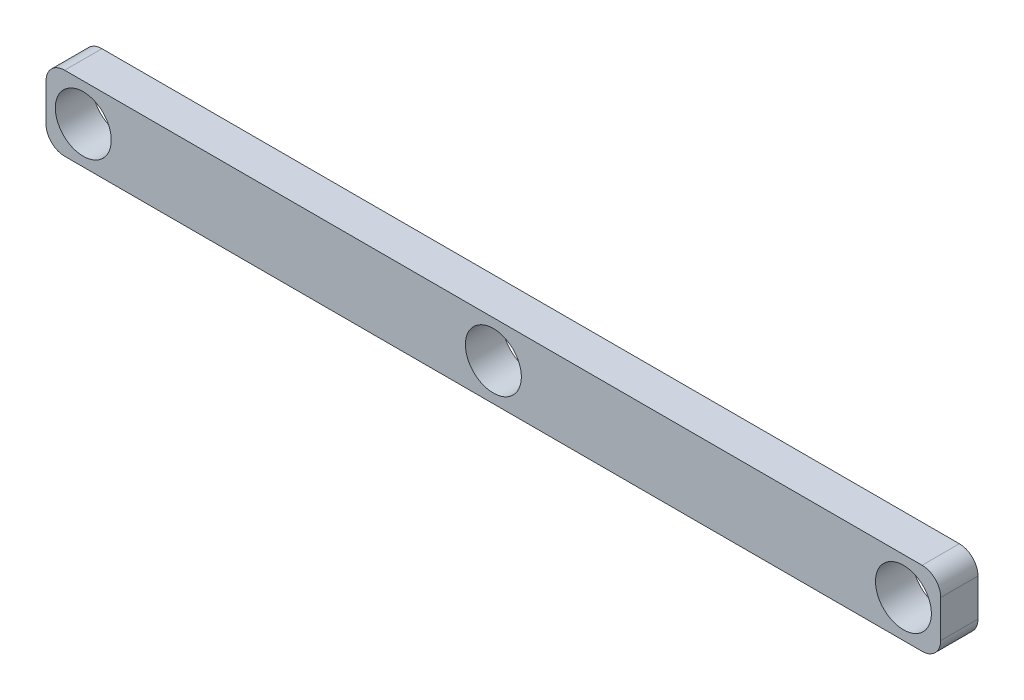
ISO-10303-21;
HEADER;
FILE_DESCRIPTION(('STEP AP214'),'2;1');
FILE_NAME('part.step','',(''),(''),'','','');
FILE_SCHEMA(('AUTOMOTIVE_DESIGN { 1 0 10303 214 1 1 1 1 }'));
ENDSEC;
DATA;
#1=APPLICATION_CONTEXT('core data for automotive mechanical design processes');
#2=APPLICATION_PROTOCOL_DEFINITION('international standard','automotive_design',2000,#1);
#3=PRODUCT_CONTEXT('',#1,'mechanical');
#4=PRODUCT('Part','Part','',(#3));
#5=PRODUCT_RELATED_PRODUCT_CATEGORY('part','',(#4));
#6=PRODUCT_DEFINITION_FORMATION('','',#4);
#7=PRODUCT_DEFINITION_CONTEXT('part definition',#1,'design');
#8=PRODUCT_DEFINITION('design','',#6,#7);
#9=PRODUCT_DEFINITION_SHAPE('','',#8);
#10=(LENGTH_UNIT() NAMED_UNIT(*) SI_UNIT(.MILLI.,.METRE.));
#11=(NAMED_UNIT(*) PLANE_ANGLE_UNIT() SI_UNIT($,.RADIAN.));
#12=(NAMED_UNIT(*) SI_UNIT($,.STERADIAN.) SOLID_ANGLE_UNIT());
#13=UNCERTAINTY_MEASURE_WITH_UNIT(LENGTH_MEASURE(1.E-05),#10,'distance_accuracy_value','');
#14=(GEOMETRIC_REPRESENTATION_CONTEXT(3) GLOBAL_UNCERTAINTY_ASSIGNED_CONTEXT((#13)) GLOBAL_UNIT_ASSIGNED_CONTEXT((#10,
#11,#12)) REPRESENTATION_CONTEXT('',''));
#15=CARTESIAN_POINT('',(0.,0.,0.));
#16=DIRECTION('',(0.,0.,1.));
#17=DIRECTION('',(1.,0.,0.));
#18=AXIS2_PLACEMENT_3D('',#15,#16,#17);
#19=CARTESIAN_POINT('',(0.,0.,25.4));
#20=DIRECTION('',(1.,0.,0.));
#21=DIRECTION('',(0.,0.,-1.));
#22=AXIS2_PLACEMENT_3D('',#19,#20,#21);
#23=PLANE('',#22);
#24=DIRECTION('',(0.,-1.,0.));
#25=VECTOR('',#24,1.);
#26=CARTESIAN_POINT('',(0.,0.,0.));
#27=LINE('',#26,#25);
#28=CARTESIAN_POINT('',(0.,38.1,0.));
#29=VERTEX_POINT('',#28);
#30=CARTESIAN_POINT('',(0.,12.7,0.));
#31=VERTEX_POINT('',#30);
#32=EDGE_CURVE('E182',#29,#31,#27,.T.);
#33=ORIENTED_EDGE('',*,*,#32,.T.);
#34=DIRECTION('',(0.,0.,-1.));
#35=VECTOR('',#34,1.);
#36=CARTESIAN_POINT('',(0.,12.7,25.4));
#37=LINE('',#36,#35);
#38=CARTESIAN_POINT('',(0.,12.7,25.4));
#39=VERTEX_POINT('',#38);
#40=EDGE_CURVE('E11',#31,#39,#37,.F.);
#41=ORIENTED_EDGE('',*,*,#40,.T.);
#42=DIRECTION('',(0.,-1.,0.));
#43=VECTOR('',#42,1.);
#44=CARTESIAN_POINT('',(0.,0.,25.4));
#45=LINE('',#44,#43);
#46=CARTESIAN_POINT('',(0.,38.1,25.4));
#47=VERTEX_POINT('',#46);
#48=EDGE_CURVE('E135',#47,#39,#45,.T.);
#49=ORIENTED_EDGE('',*,*,#48,.F.);
#50=DIRECTION('',(0.,0.,-1.));
#51=VECTOR('',#50,1.);
#52=CARTESIAN_POINT('',(0.,38.1,25.4));
#53=LINE('',#52,#51);
#54=EDGE_CURVE('E48',#47,#29,#53,.T.);
#55=ORIENTED_EDGE('',*,*,#54,.T.);
#56=EDGE_LOOP('',(#33,#41,#49,#55));
#57=FACE_BOUND('',#56,.T.);
#58=ADVANCED_FACE('F39',(#57),#23,.F.);
#59=CARTESIAN_POINT('',(0.,0.,25.4));
#60=DIRECTION('',(0.,1.,0.));
#61=DIRECTION('',(0.,0.,1.));
#62=AXIS2_PLACEMENT_3D('',#59,#60,#61);
#63=PLANE('',#62);
#64=DIRECTION('',(1.,0.,0.));
#65=VECTOR('',#64,1.);
#66=CARTESIAN_POINT('',(0.,0.,0.));
#67=LINE('',#66,#65);
#68=CARTESIAN_POINT('',(12.7,0.,0.));
#69=VERTEX_POINT('',#68);
#70=CARTESIAN_POINT('',(596.9,0.,0.));
#71=VERTEX_POINT('',#70);
#72=EDGE_CURVE('E142',#69,#71,#67,.T.);
#73=ORIENTED_EDGE('',*,*,#72,.T.);
#74=DIRECTION('',(0.,0.,-1.));
#75=VECTOR('',#74,1.);
#76=CARTESIAN_POINT('',(596.9,0.,25.4));
#77=LINE('',#76,#75);
#78=CARTESIAN_POINT('',(596.9,0.,25.4));
#79=VERTEX_POINT('',#78);
#80=EDGE_CURVE('E55',#71,#79,#77,.F.);
#81=ORIENTED_EDGE('',*,*,#80,.T.);
#82=DIRECTION('',(1.,0.,0.));
#83=VECTOR('',#82,1.);
#84=CARTESIAN_POINT('',(0.,0.,25.4));
#85=LINE('',#84,#83);
#86=CARTESIAN_POINT('',(12.7,0.,25.4));
#87=VERTEX_POINT('',#86);
#88=EDGE_CURVE('E140',#87,#79,#85,.T.);
#89=ORIENTED_EDGE('',*,*,#88,.F.);
#90=DIRECTION('',(0.,0.,-1.));
#91=VECTOR('',#90,1.);
#92=CARTESIAN_POINT('',(12.7,0.,25.4));
#93=LINE('',#92,#91);
#94=EDGE_CURVE('E171',#87,#69,#93,.T.);
#95=ORIENTED_EDGE('',*,*,#94,.T.);
#96=EDGE_LOOP('',(#73,#81,#89,#95));
#97=FACE_BOUND('',#96,.T.);
#98=ADVANCED_FACE('F247',(#97),#63,.F.);
#99=CARTESIAN_POINT('',(609.6,0.,25.4));
#100=DIRECTION('',(-1.,0.,0.));
#101=DIRECTION('',(0.,0.,1.));
#102=AXIS2_PLACEMENT_3D('',#99,#100,#101);
#103=PLANE('',#102);
#104=DIRECTION('',(0.,1.,0.));
#105=VECTOR('',#104,1.);
#106=CARTESIAN_POINT('',(609.6,0.,0.));
#107=LINE('',#106,#105);
#108=CARTESIAN_POINT('',(609.6,12.7,0.));
#109=VERTEX_POINT('',#108);
#110=CARTESIAN_POINT('',(609.6,38.1,0.));
#111=VERTEX_POINT('',#110);
#112=EDGE_CURVE('E136',#109,#111,#107,.T.);
#113=ORIENTED_EDGE('',*,*,#112,.T.);
#114=DIRECTION('',(0.,0.,-1.));
#115=VECTOR('',#114,1.);
#116=CARTESIAN_POINT('',(609.6,38.1,25.4));
#117=LINE('',#116,#115);
#118=CARTESIAN_POINT('',(609.6,38.1,25.4));
#119=VERTEX_POINT('',#118);
#120=EDGE_CURVE('E111',#111,#119,#117,.F.);
#121=ORIENTED_EDGE('',*,*,#120,.T.);
#122=DIRECTION('',(0.,1.,0.));
#123=VECTOR('',#122,1.);
#124=CARTESIAN_POINT('',(609.6,0.,25.4));
#125=LINE('',#124,#123);
#126=CARTESIAN_POINT('',(609.6,12.7,25.4));
#127=VERTEX_POINT('',#126);
#128=EDGE_CURVE('E198',#127,#119,#125,.T.);
#129=ORIENTED_EDGE('',*,*,#128,.F.);
#130=DIRECTION('',(0.,0.,-1.));
#131=VECTOR('',#130,1.);
#132=CARTESIAN_POINT('',(609.6,12.7,25.4));
#133=LINE('',#132,#131);
#134=EDGE_CURVE('E117',#127,#109,#133,.T.);
#135=ORIENTED_EDGE('',*,*,#134,.T.);
#136=EDGE_LOOP('',(#113,#121,#129,#135));
#137=FACE_BOUND('',#136,.T.);
#138=ADVANCED_FACE('F244',(#137),#103,.F.);
#139=CARTESIAN_POINT('',(0.,50.8,25.4));
#140=DIRECTION('',(0.,-1.,0.));
#141=DIRECTION('',(0.,0.,-1.));
#142=AXIS2_PLACEMENT_3D('',#139,#140,#141);
#143=PLANE('',#142);
#144=DIRECTION('',(-1.,0.,0.));
#145=VECTOR('',#144,1.);
#146=CARTESIAN_POINT('',(0.,50.8,25.4));
#147=LINE('',#146,#145);
#148=CARTESIAN_POINT('',(596.9,50.8,25.4));
#149=VERTEX_POINT('',#148);
#150=CARTESIAN_POINT('',(12.7,50.8,25.4));
#151=VERTEX_POINT('',#150);
#152=EDGE_CURVE('E127',#149,#151,#147,.T.);
#153=ORIENTED_EDGE('',*,*,#152,.F.);
#154=DIRECTION('',(0.,0.,-1.));
#155=VECTOR('',#154,1.);
#156=CARTESIAN_POINT('',(596.9,50.8,25.4));
#157=LINE('',#156,#155);
#158=CARTESIAN_POINT('',(596.9,50.8,0.));
#159=VERTEX_POINT('',#158);
#160=EDGE_CURVE('E110',#149,#159,#157,.T.);
#161=ORIENTED_EDGE('',*,*,#160,.T.);
#162=DIRECTION('',(-1.,0.,0.));
#163=VECTOR('',#162,1.);
#164=CARTESIAN_POINT('',(0.,50.8,0.));
#165=LINE('',#164,#163);
#166=CARTESIAN_POINT('',(12.7,50.8,0.));
#167=VERTEX_POINT('',#166);
#168=EDGE_CURVE('E124',#159,#167,#165,.T.);
#169=ORIENTED_EDGE('',*,*,#168,.T.);
#170=DIRECTION('',(0.,0.,-1.));
#171=VECTOR('',#170,1.);
#172=CARTESIAN_POINT('',(12.7,50.8,25.4));
#173=LINE('',#172,#171);
#174=EDGE_CURVE('E130',#167,#151,#173,.F.);
#175=ORIENTED_EDGE('',*,*,#174,.T.);
#176=EDGE_LOOP('',(#153,#161,#169,#175));
#177=FACE_BOUND('',#176,.T.);
#178=ADVANCED_FACE('F123',(#177),#143,.F.);
#179=CARTESIAN_POINT('',(0.,0.,25.4));
#180=DIRECTION('',(0.,0.,-1.));
#181=DIRECTION('',(-1.,0.,0.));
#182=AXIS2_PLACEMENT_3D('',#179,#180,#181);
#183=PLANE('',#182);
#184=CARTESIAN_POINT('',(25.4,25.4,25.4));
#185=DIRECTION('',(0.,0.,1.));
#186=DIRECTION('',(1.,0.,0.));
#187=AXIS2_PLACEMENT_3D('',#184,#185,#186);
#188=CIRCLE('',#187,19.05);
#189=CARTESIAN_POINT('',(44.45,25.4,25.4));
#190=VERTEX_POINT('',#189);
#191=EDGE_CURVE('E216',#190,#190,#188,.T.);
#192=ORIENTED_EDGE('',*,*,#191,.F.);
#193=EDGE_LOOP('',(#192));
#194=FACE_BOUND('',#193,.T.);
#195=CARTESIAN_POINT('',(304.8,25.4,25.4));
#196=DIRECTION('',(0.,0.,-1.));
#197=DIRECTION('',(-1.,0.,0.));
#198=AXIS2_PLACEMENT_3D('',#195,#196,#197);
#199=CIRCLE('',#198,19.05);
#200=CARTESIAN_POINT('',(285.75,25.4,25.4));
#201=VERTEX_POINT('',#200);
#202=EDGE_CURVE('E206',#201,#201,#199,.T.);
#203=ORIENTED_EDGE('',*,*,#202,.T.);
#204=EDGE_LOOP('',(#203));
#205=FACE_BOUND('',#204,.T.);
#206=CARTESIAN_POINT('',(584.2,25.4,25.4));
#207=DIRECTION('',(0.,0.,1.));
#208=DIRECTION('',(1.,0.,0.));
#209=AXIS2_PLACEMENT_3D('',#206,#207,#208);
#210=CIRCLE('',#209,19.05);
#211=CARTESIAN_POINT('',(603.25,25.4,25.4));
#212=VERTEX_POINT('',#211);
#213=EDGE_CURVE('E193',#212,#212,#210,.T.);
#214=ORIENTED_EDGE('',*,*,#213,.F.);
#215=EDGE_LOOP('',(#214));
#216=FACE_BOUND('',#215,.T.);
#217=ORIENTED_EDGE('',*,*,#128,.T.);
#218=CARTESIAN_POINT('',(596.9,38.1,25.4));
#219=DIRECTION('',(0.,0.,-1.));
#220=DIRECTION('',(-1.,0.,0.));
#221=AXIS2_PLACEMENT_3D('',#218,#219,#220);
#222=CIRCLE('',#221,12.7);
#223=EDGE_CURVE('E168',#119,#149,#222,.F.);
#224=ORIENTED_EDGE('',*,*,#223,.T.);
#225=ORIENTED_EDGE('',*,*,#152,.T.);
#226=CARTESIAN_POINT('',(12.7,38.1,25.4));
#227=DIRECTION('',(0.,0.,-1.));
#228=DIRECTION('',(-1.,0.,0.));
#229=AXIS2_PLACEMENT_3D('',#226,#227,#228);
#230=CIRCLE('',#229,12.7);
#231=EDGE_CURVE('E160',#151,#47,#230,.F.);
#232=ORIENTED_EDGE('',*,*,#231,.T.);
#233=ORIENTED_EDGE('',*,*,#48,.T.);
#234=CARTESIAN_POINT('',(12.7,12.7,25.4));
#235=DIRECTION('',(0.,0.,-1.));
#236=DIRECTION('',(-1.,0.,0.));
#237=AXIS2_PLACEMENT_3D('',#234,#235,#236);
#238=CIRCLE('',#237,12.7);
#239=EDGE_CURVE('E62',#39,#87,#238,.F.);
#240=ORIENTED_EDGE('',*,*,#239,.T.);
#241=ORIENTED_EDGE('',*,*,#88,.T.);
#242=CARTESIAN_POINT('',(596.9,12.7,25.4));
#243=DIRECTION('',(0.,0.,-1.));
#244=DIRECTION('',(-1.,0.,0.));
#245=AXIS2_PLACEMENT_3D('',#242,#243,#244);
#246=CIRCLE('',#245,12.7);
#247=EDGE_CURVE('E165',#79,#127,#246,.F.);
#248=ORIENTED_EDGE('',*,*,#247,.T.);
#249=EDGE_LOOP('',(#217,#224,#225,#232,#233,#240,#241,#248));
#250=FACE_BOUND('',#249,.T.);
#251=ADVANCED_FACE('F233',(#194,#205,#216,#250),#183,.F.);
#252=CARTESIAN_POINT('',(0.,0.,0.));
#253=DIRECTION('',(0.,0.,-1.));
#254=DIRECTION('',(-1.,0.,0.));
#255=AXIS2_PLACEMENT_3D('',#252,#253,#254);
#256=PLANE('',#255);
#257=CARTESIAN_POINT('',(25.4,25.4,0.));
#258=DIRECTION('',(0.,0.,1.));
#259=DIRECTION('',(1.,0.,0.));
#260=AXIS2_PLACEMENT_3D('',#257,#258,#259);
#261=CIRCLE('',#260,19.05);
#262=CARTESIAN_POINT('',(44.45,25.4,0.));
#263=VERTEX_POINT('',#262);
#264=EDGE_CURVE('E212',#263,#263,#261,.T.);
#265=ORIENTED_EDGE('',*,*,#264,.T.);
#266=EDGE_LOOP('',(#265));
#267=FACE_BOUND('',#266,.T.);
#268=CARTESIAN_POINT('',(304.8,25.4,0.));
#269=DIRECTION('',(0.,0.,-1.));
#270=DIRECTION('',(-1.,0.,0.));
#271=AXIS2_PLACEMENT_3D('',#268,#269,#270);
#272=CIRCLE('',#271,19.05);
#273=CARTESIAN_POINT('',(285.75,25.4,0.));
#274=VERTEX_POINT('',#273);
#275=EDGE_CURVE('E208',#274,#274,#272,.T.);
#276=ORIENTED_EDGE('',*,*,#275,.F.);
#277=EDGE_LOOP('',(#276));
#278=FACE_BOUND('',#277,.T.);
#279=CARTESIAN_POINT('',(584.2,25.4,0.));
#280=DIRECTION('',(0.,0.,1.));
#281=DIRECTION('',(1.,0.,0.));
#282=AXIS2_PLACEMENT_3D('',#279,#280,#281);
#283=CIRCLE('',#282,19.05);
#284=CARTESIAN_POINT('',(603.25,25.4,0.));
#285=VERTEX_POINT('',#284);
#286=EDGE_CURVE('E188',#285,#285,#283,.T.);
#287=ORIENTED_EDGE('',*,*,#286,.T.);
#288=EDGE_LOOP('',(#287));
#289=FACE_BOUND('',#288,.T.);
#290=ORIENTED_EDGE('',*,*,#168,.F.);
#291=CARTESIAN_POINT('',(596.9,38.1,0.));
#292=DIRECTION('',(0.,0.,-1.));
#293=DIRECTION('',(-1.,0.,0.));
#294=AXIS2_PLACEMENT_3D('',#291,#292,#293);
#295=CIRCLE('',#294,12.7);
#296=EDGE_CURVE('E106',#159,#111,#295,.T.);
#297=ORIENTED_EDGE('',*,*,#296,.T.);
#298=ORIENTED_EDGE('',*,*,#112,.F.);
#299=CARTESIAN_POINT('',(596.9,12.7,0.));
#300=DIRECTION('',(0.,0.,-1.));
#301=DIRECTION('',(-1.,0.,0.));
#302=AXIS2_PLACEMENT_3D('',#299,#300,#301);
#303=CIRCLE('',#302,12.7);
#304=EDGE_CURVE('E118',#109,#71,#303,.T.);
#305=ORIENTED_EDGE('',*,*,#304,.T.);
#306=ORIENTED_EDGE('',*,*,#72,.F.);
#307=CARTESIAN_POINT('',(12.7,12.7,0.));
#308=DIRECTION('',(0.,0.,-1.));
#309=DIRECTION('',(-1.,0.,0.));
#310=AXIS2_PLACEMENT_3D('',#307,#308,#309);
#311=CIRCLE('',#310,12.7);
#312=EDGE_CURVE('E150',#69,#31,#311,.T.);
#313=ORIENTED_EDGE('',*,*,#312,.T.);
#314=ORIENTED_EDGE('',*,*,#32,.F.);
#315=CARTESIAN_POINT('',(12.7,38.1,0.));
#316=DIRECTION('',(0.,0.,-1.));
#317=DIRECTION('',(-1.,0.,0.));
#318=AXIS2_PLACEMENT_3D('',#315,#316,#317);
#319=CIRCLE('',#318,12.7);
#320=EDGE_CURVE('E129',#29,#167,#319,.T.);
#321=ORIENTED_EDGE('',*,*,#320,.T.);
#322=EDGE_LOOP('',(#290,#297,#298,#305,#306,#313,#314,#321));
#323=FACE_BOUND('',#322,.T.);
#324=ADVANCED_FACE('F132',(#267,#278,#289,#323),#256,.T.);
#325=CARTESIAN_POINT('',(596.9,38.1,25.4));
#326=DIRECTION('',(0.,0.,-1.));
#327=DIRECTION('',(-1.,0.,0.));
#328=AXIS2_PLACEMENT_3D('',#325,#326,#327);
#329=CYLINDRICAL_SURFACE('',#328,12.7);
#330=ORIENTED_EDGE('',*,*,#223,.F.);
#331=ORIENTED_EDGE('',*,*,#120,.F.);
#332=ORIENTED_EDGE('',*,*,#296,.F.);
#333=ORIENTED_EDGE('',*,*,#160,.F.);
#334=EDGE_LOOP('',(#330,#331,#332,#333));
#335=FACE_BOUND('',#334,.T.);
#336=ADVANCED_FACE('F109',(#335),#329,.T.);
#337=CARTESIAN_POINT('',(596.9,12.7,25.4));
#338=DIRECTION('',(0.,0.,-1.));
#339=DIRECTION('',(-1.,0.,0.));
#340=AXIS2_PLACEMENT_3D('',#337,#338,#339);
#341=CYLINDRICAL_SURFACE('',#340,12.7);
#342=ORIENTED_EDGE('',*,*,#247,.F.);
#343=ORIENTED_EDGE('',*,*,#80,.F.);
#344=ORIENTED_EDGE('',*,*,#304,.F.);
#345=ORIENTED_EDGE('',*,*,#134,.F.);
#346=EDGE_LOOP('',(#342,#343,#344,#345));
#347=FACE_BOUND('',#346,.T.);
#348=ADVANCED_FACE('F246',(#347),#341,.T.);
#349=CARTESIAN_POINT('',(12.7,12.7,25.4));
#350=DIRECTION('',(0.,0.,-1.));
#351=DIRECTION('',(-1.,0.,0.));
#352=AXIS2_PLACEMENT_3D('',#349,#350,#351);
#353=CYLINDRICAL_SURFACE('',#352,12.7);
#354=ORIENTED_EDGE('',*,*,#239,.F.);
#355=ORIENTED_EDGE('',*,*,#40,.F.);
#356=ORIENTED_EDGE('',*,*,#312,.F.);
#357=ORIENTED_EDGE('',*,*,#94,.F.);
#358=EDGE_LOOP('',(#354,#355,#356,#357));
#359=FACE_BOUND('',#358,.T.);
#360=ADVANCED_FACE('F250',(#359),#353,.T.);
#361=CARTESIAN_POINT('',(12.7,38.1,25.4));
#362=DIRECTION('',(0.,0.,-1.));
#363=DIRECTION('',(-1.,0.,0.));
#364=AXIS2_PLACEMENT_3D('',#361,#362,#363);
#365=CYLINDRICAL_SURFACE('',#364,12.7);
#366=ORIENTED_EDGE('',*,*,#231,.F.);
#367=ORIENTED_EDGE('',*,*,#174,.F.);
#368=ORIENTED_EDGE('',*,*,#320,.F.);
#369=ORIENTED_EDGE('',*,*,#54,.F.);
#370=EDGE_LOOP('',(#366,#367,#368,#369));
#371=FACE_BOUND('',#370,.T.);
#372=ADVANCED_FACE('F41',(#371),#365,.T.);
#373=CARTESIAN_POINT('',(584.2,25.4,0.));
#374=DIRECTION('',(0.,0.,1.));
#375=DIRECTION('',(1.,0.,0.));
#376=AXIS2_PLACEMENT_3D('',#373,#374,#375);
#377=CYLINDRICAL_SURFACE('',#376,19.05);
#378=ORIENTED_EDGE('',*,*,#286,.F.);
#379=EDGE_LOOP('',(#378));
#380=FACE_BOUND('',#379,.T.);
#381=ORIENTED_EDGE('',*,*,#213,.T.);
#382=EDGE_LOOP('',(#381));
#383=FACE_BOUND('',#382,.T.);
#384=ADVANCED_FACE('F252',(#380,#383),#377,.F.);
#385=CARTESIAN_POINT('',(304.8,25.4,25.4));
#386=DIRECTION('',(0.,0.,-1.));
#387=DIRECTION('',(-1.,0.,0.));
#388=AXIS2_PLACEMENT_3D('',#385,#386,#387);
#389=CYLINDRICAL_SURFACE('',#388,19.05);
#390=ORIENTED_EDGE('',*,*,#202,.F.);
#391=EDGE_LOOP('',(#390));
#392=FACE_BOUND('',#391,.T.);
#393=ORIENTED_EDGE('',*,*,#275,.T.);
#394=EDGE_LOOP('',(#393));
#395=FACE_BOUND('',#394,.T.);
#396=ADVANCED_FACE('F229',(#392,#395),#389,.F.);
#397=CARTESIAN_POINT('',(25.4,25.4,0.));
#398=DIRECTION('',(0.,0.,1.));
#399=DIRECTION('',(1.,0.,0.));
#400=AXIS2_PLACEMENT_3D('',#397,#398,#399);
#401=CYLINDRICAL_SURFACE('',#400,19.05);
#402=ORIENTED_EDGE('',*,*,#264,.F.);
#403=EDGE_LOOP('',(#402));
#404=FACE_BOUND('',#403,.T.);
#405=ORIENTED_EDGE('',*,*,#191,.T.);
#406=EDGE_LOOP('',(#405));
#407=FACE_BOUND('',#406,.T.);
#408=ADVANCED_FACE('F226',(#404,#407),#401,.F.);
#409=CLOSED_SHELL('',(#58,#98,#138,#178,#251,#324,#336,#348,#360,#372,#384,#396,#408));
#410=MANIFOLD_SOLID_BREP('B2',#409);
#411=ADVANCED_BREP_SHAPE_REPRESENTATION('',(#18,#410),#14);
#412=SHAPE_DEFINITION_REPRESENTATION(#9,#411);
ENDSEC;
END-ISO-10303-21;
